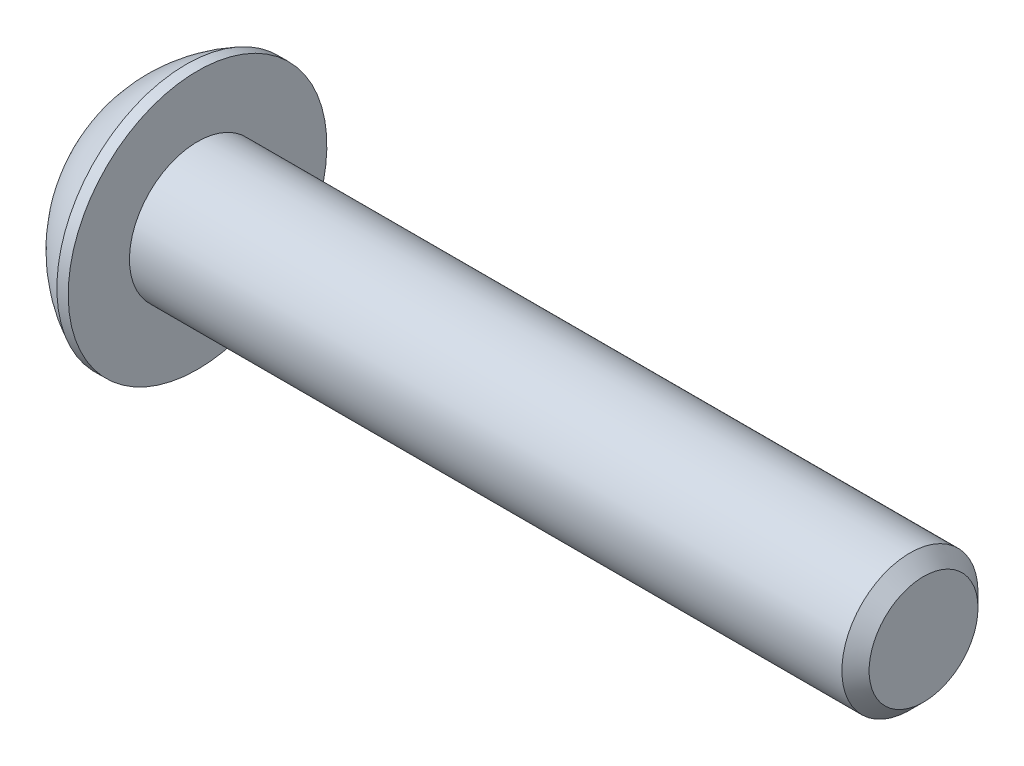
ISO-10303-21;
HEADER;
FILE_DESCRIPTION(('STEP AP214'),'2;1');
FILE_NAME('part.step','',(''),(''),'','','');
FILE_SCHEMA(('AUTOMOTIVE_DESIGN { 1 0 10303 214 1 1 1 1 }'));
ENDSEC;
DATA;
#1=APPLICATION_CONTEXT('core data for automotive mechanical design processes');
#2=APPLICATION_PROTOCOL_DEFINITION('international standard','automotive_design',2000,#1);
#3=PRODUCT_CONTEXT('',#1,'mechanical');
#4=PRODUCT('Part','Part','',(#3));
#5=PRODUCT_RELATED_PRODUCT_CATEGORY('part','',(#4));
#6=PRODUCT_DEFINITION_FORMATION('','',#4);
#7=PRODUCT_DEFINITION_CONTEXT('part definition',#1,'design');
#8=PRODUCT_DEFINITION('design','',#6,#7);
#9=PRODUCT_DEFINITION_SHAPE('','',#8);
#10=(LENGTH_UNIT() NAMED_UNIT(*) SI_UNIT(.MILLI.,.METRE.));
#11=(NAMED_UNIT(*) PLANE_ANGLE_UNIT() SI_UNIT($,.RADIAN.));
#12=(NAMED_UNIT(*) SI_UNIT($,.STERADIAN.) SOLID_ANGLE_UNIT());
#13=UNCERTAINTY_MEASURE_WITH_UNIT(LENGTH_MEASURE(1.E-05),#10,'distance_accuracy_value','');
#14=(GEOMETRIC_REPRESENTATION_CONTEXT(3) GLOBAL_UNCERTAINTY_ASSIGNED_CONTEXT((#13)) GLOBAL_UNIT_ASSIGNED_CONTEXT((#10,
#11,#12)) REPRESENTATION_CONTEXT('',''));
#15=CARTESIAN_POINT('',(0.,0.,0.));
#16=DIRECTION('',(0.,0.,1.));
#17=DIRECTION('',(1.,0.,0.));
#18=AXIS2_PLACEMENT_3D('',#15,#16,#17);
#19=CARTESIAN_POINT('',(-16.,0.,0.));
#20=DIRECTION('',(1.,0.,0.));
#21=DIRECTION('',(0.,0.,-1.));
#22=AXIS2_PLACEMENT_3D('',#19,#20,#21);
#23=CYLINDRICAL_SURFACE('',#22,1.5);
#24=CARTESIAN_POINT('',(-0.299999999999998,0.,0.));
#25=DIRECTION('',(1.,0.,0.));
#26=DIRECTION('',(0.,0.,-1.));
#27=AXIS2_PLACEMENT_3D('',#24,#25,#26);
#28=CIRCLE('',#27,1.5);
#29=CARTESIAN_POINT('',(-0.299999999999998,0.,-1.5));
#30=VERTEX_POINT('',#29);
#31=EDGE_CURVE('E55',#30,#30,#28,.F.);
#32=ORIENTED_EDGE('',*,*,#31,.T.);
#33=EDGE_LOOP('',(#32));
#34=FACE_BOUND('',#33,.T.);
#35=CARTESIAN_POINT('',(-16.,0.,0.));
#36=DIRECTION('',(-1.,0.,0.));
#37=DIRECTION('',(0.,-1.,0.));
#38=AXIS2_PLACEMENT_3D('',#35,#36,#37);
#39=CIRCLE('',#38,1.5);
#40=CARTESIAN_POINT('',(-16.,-1.50000000000001,0.));
#41=VERTEX_POINT('',#40);
#42=EDGE_CURVE('E134',#41,#41,#39,.F.);
#43=ORIENTED_EDGE('',*,*,#42,.T.);
#44=EDGE_LOOP('',(#43));
#45=FACE_BOUND('',#44,.T.);
#46=ADVANCED_FACE('F41',(#34,#45),#23,.T.);
#47=CARTESIAN_POINT('',(0.,0.,0.));
#48=DIRECTION('',(1.,0.,0.));
#49=DIRECTION('',(0.,0.,-1.));
#50=AXIS2_PLACEMENT_3D('',#47,#48,#49);
#51=PLANE('',#50);
#52=CARTESIAN_POINT('',(0.,0.,0.));
#53=DIRECTION('',(1.,0.,0.));
#54=DIRECTION('',(0.,0.,-1.));
#55=AXIS2_PLACEMENT_3D('',#52,#53,#54);
#56=CIRCLE('',#55,1.2);
#57=CARTESIAN_POINT('',(0.,0.,-1.2));
#58=VERTEX_POINT('',#57);
#59=EDGE_CURVE('E137',#58,#58,#56,.T.);
#60=ORIENTED_EDGE('',*,*,#59,.T.);
#61=EDGE_LOOP('',(#60));
#62=FACE_BOUND('',#61,.T.);
#63=ADVANCED_FACE('F147',(#62),#51,.T.);
#64=CARTESIAN_POINT('',(0.,0.,0.));
#65=DIRECTION('',(-1.,0.,0.));
#66=DIRECTION('',(0.,0.,1.));
#67=AXIS2_PLACEMENT_3D('',#64,#65,#66);
#68=CONICAL_SURFACE('',#67,1.2,0.785398163397444);
#69=ORIENTED_EDGE('',*,*,#31,.F.);
#70=EDGE_LOOP('',(#69));
#71=FACE_BOUND('',#70,.T.);
#72=ORIENTED_EDGE('',*,*,#59,.F.);
#73=EDGE_LOOP('',(#72));
#74=FACE_BOUND('',#73,.T.);
#75=ADVANCED_FACE('F43',(#71,#74),#68,.T.);
#76=CARTESIAN_POINT('',(-17.65,0.,0.));
#77=DIRECTION('',(1.,0.,0.));
#78=DIRECTION('',(0.,1.,0.));
#79=AXIS2_PLACEMENT_3D('',#76,#77,#78);
#80=PLANE('',#79);
#81=CARTESIAN_POINT('',(-17.65,0.,0.));
#82=DIRECTION('',(-1.,0.,0.));
#83=DIRECTION('',(0.,-1.,0.));
#84=AXIS2_PLACEMENT_3D('',#81,#82,#83);
#85=CIRCLE('',#84,1.20470053837926);
#86=CARTESIAN_POINT('',(-17.65,-1.20470053837926,0.));
#87=VERTEX_POINT('',#86);
#88=EDGE_CURVE('E256',#87,#87,#85,.T.);
#89=ORIENTED_EDGE('',*,*,#88,.F.);
#90=EDGE_LOOP('',(#89));
#91=FACE_BOUND('',#90,.T.);
#92=CARTESIAN_POINT('',(-17.65,0.,0.));
#93=DIRECTION('',(-1.,0.,0.));
#94=DIRECTION('',(0.,-1.,0.));
#95=AXIS2_PLACEMENT_3D('',#92,#93,#94);
#96=CIRCLE('',#95,1.5);
#97=CARTESIAN_POINT('',(-17.65,1.5,0.));
#98=VERTEX_POINT('',#97);
#99=EDGE_CURVE('E131',#98,#98,#96,.T.);
#100=ORIENTED_EDGE('',*,*,#99,.T.);
#101=EDGE_LOOP('',(#100));
#102=FACE_BOUND('',#101,.T.);
#103=ADVANCED_FACE('F146',(#91,#102),#80,.F.);
#104=CARTESIAN_POINT('',(-14.8526785714286,0.,0.));
#105=DIRECTION('',(-1.,0.,0.));
#106=DIRECTION('',(0.,1.,0.));
#107=AXIS2_PLACEMENT_3D('',#104,#105,#106);
#108=SPHERICAL_SURFACE('',#107,3.17411517981703);
#109=CARTESIAN_POINT('',(-16.25,0.,0.));
#110=DIRECTION('',(-1.,0.,0.));
#111=DIRECTION('',(0.,-1.,0.));
#112=AXIS2_PLACEMENT_3D('',#109,#110,#111);
#113=CIRCLE('',#112,2.85);
#114=CARTESIAN_POINT('',(-16.25,2.85,0.));
#115=VERTEX_POINT('',#114);
#116=EDGE_CURVE('E128',#115,#115,#113,.T.);
#117=CARTESIAN_POINT('',(-17.65,1.5,0.));
#118=CARTESIAN_POINT('',(-17.6402697017537,1.51814590550861,0.));
#119=CARTESIAN_POINT('',(-17.6303627914101,1.53619710575443,0.));
#120=CARTESIAN_POINT('',(-17.6101996026695,1.57210331824231,0.));
#121=CARTESIAN_POINT('',(-17.5999433242725,1.58995833048437,0.));
#122=CARTESIAN_POINT('',(-17.5790852555662,1.62546538948657,0.));
#123=CARTESIAN_POINT('',(-17.5684834652569,1.6431174362467,0.));
#124=CARTESIAN_POINT('',(-17.5469383951658,1.67821188357876,0.));
#125=CARTESIAN_POINT('',(-17.535995115384,1.69565428415068,0.));
#126=CARTESIAN_POINT('',(-17.513771208612,1.73032283245973,0.));
#127=CARTESIAN_POINT('',(-17.5024905816219,1.74754898019686,0.));
#128=CARTESIAN_POINT('',(-17.4795962529979,1.78177849951501,0.));
#129=CARTESIAN_POINT('',(-17.467982551364,1.79878187109604,0.));
#130=CARTESIAN_POINT('',(-17.4444264714719,1.83255939876409,0.));
#131=CARTESIAN_POINT('',(-17.4324840932136,1.84933355485112,0.));
#132=CARTESIAN_POINT('',(-17.4082751827463,1.88264629910088,0.));
#133=CARTESIAN_POINT('',(-17.3960086505372,1.89918488726362,0.));
#134=CARTESIAN_POINT('',(-17.3711560775515,1.93202023241769,0.));
#135=CARTESIAN_POINT('',(-17.3585700367748,1.94831698940902,0.));
#136=CARTESIAN_POINT('',(-17.3330832130497,1.98066250056315,0.));
#137=CARTESIAN_POINT('',(-17.3201824301012,1.99671125472595,0.));
#138=CARTESIAN_POINT('',(-17.2940710076189,2.02855468248373,0.));
#139=CARTESIAN_POINT('',(-17.2808603680851,2.04434935607872,0.));
#140=CARTESIAN_POINT('',(-17.254134235364,2.07567864118366,0.));
#141=CARTESIAN_POINT('',(-17.2406187421766,2.09121325269361,0.));
#142=CARTESIAN_POINT('',(-17.2132880205292,2.12201653059784,0.));
#143=CARTESIAN_POINT('',(-17.1994727920692,2.13728519699211,0.));
#144=CARTESIAN_POINT('',(-17.1715478317686,2.16755080234906,0.));
#145=CARTESIAN_POINT('',(-17.157438099928,2.18254774131173,0.));
#146=CARTESIAN_POINT('',(-17.1289294762883,2.21226421239399,0.));
#147=CARTESIAN_POINT('',(-17.1145305844891,2.22698374451357,0.));
#148=CARTESIAN_POINT('',(-17.0854490938605,2.25613982755346,0.));
#149=CARTESIAN_POINT('',(-17.0707664950309,2.27057637847377,0.));
#150=CARTESIAN_POINT('',(-17.0411231507109,2.29916103192521,0.));
#151=CARTESIAN_POINT('',(-17.0261624052204,2.31330913445635,0.));
#152=CARTESIAN_POINT('',(-16.9959684332833,2.34131153317633,0.));
#153=CARTESIAN_POINT('',(-16.9807352068367,2.35516582936518,0.));
#154=CARTESIAN_POINT('',(-16.9500020418819,2.38257536871331,0.));
#155=CARTESIAN_POINT('',(-16.9345021033738,2.3961306118726,0.));
#156=CARTESIAN_POINT('',(-16.9032413841958,2.42293691172713,0.));
#157=CARTESIAN_POINT('',(-16.887480603526,2.43618796842238,0.));
#158=CARTESIAN_POINT('',(-16.8557041687066,2.46238087711119,0.));
#159=CARTESIAN_POINT('',(-16.839688514557,2.47532272910475,0.));
#160=CARTESIAN_POINT('',(-16.8074083979817,2.50089232724988,0.));
#161=CARTESIAN_POINT('',(-16.7911439355561,2.51352007340145,0.));
#162=CARTESIAN_POINT('',(-16.7583723618573,2.53845667767541,0.));
#163=CARTESIAN_POINT('',(-16.7418652505841,2.55076553579779,0.));
#164=CARTESIAN_POINT('',(-16.7086146305115,2.57505970259154,0.));
#165=CARTESIAN_POINT('',(-16.691871121712,2.58704501126291,0.));
#166=CARTESIAN_POINT('',(-16.658154047431,2.61068754025891,0.));
#167=CARTESIAN_POINT('',(-16.6411804819494,2.62234476058354,0.));
#168=CARTESIAN_POINT('',(-16.607009722279,2.64532669825232,0.));
#169=CARTESIAN_POINT('',(-16.5898125280901,2.65665141559648,0.));
#170=CARTESIAN_POINT('',(-16.5552010236432,2.6789640585411,0.));
#171=CARTESIAN_POINT('',(-16.5377867133852,2.68995198414156,0.));
#172=CARTESIAN_POINT('',(-16.5027475717571,2.71158688256655,0.));
#173=CARTESIAN_POINT('',(-16.485122740387,2.72223385539107,0.));
#174=CARTESIAN_POINT('',(-16.449669230859,2.74318281565686,0.));
#175=CARTESIAN_POINT('',(-16.4318405527012,2.75348480309813,0.));
#176=CARTESIAN_POINT('',(-16.395986102456,2.7737398932333,0.));
#177=CARTESIAN_POINT('',(-16.3779603303685,2.78369299592719,0.));
#178=CARTESIAN_POINT('',(-16.3417185147769,2.8032465396409,0.));
#179=CARTESIAN_POINT('',(-16.3235024712727,2.81284698066071,0.));
#180=CARTESIAN_POINT('',(-16.2868870260232,2.83169159380608,0.));
#181=CARTESIAN_POINT('',(-16.268487624278,2.84093576593164,0.));
#182=CARTESIAN_POINT('',(-16.25,2.85,0.));
#183=B_SPLINE_CURVE_WITH_KNOTS('',3,(#117,#118,#119,#120,#121,#122,#123,#124,#125,#126,#127,
#128,#129,#130,#131,#132,#133,#134,#135,#136,#137,#138,#139,#140,#141,#142,#143,#144,#145,#146,
#147,#148,#149,#150,#151,#152,#153,#154,#155,#156,#157,#158,#159,#160,#161,#162,#163,#164,#165,
#166,#167,#168,#169,#170,#171,#172,#173,#174,#175,#176,#177,#178,#179,#180,#181,#182),
.UNSPECIFIED.,.F.,.F.,(4,2,2,2,2,2,2,2,2,2,2,2,2,2,2,2,2,2,2,2,2,2,2,2,2,2,2,2,2,2,2,2,4),(0.,
0.0617693508858087,0.123538701771618,0.185308052657427,0.247077403543236,0.308846754429046,
0.370616105314855,0.432385456200665,0.494154807086473,0.555924157972284,0.617693508858093,
0.679462859743903,0.741232210629712,0.80300156151552,0.864770912401332,0.926540263287141,
0.988309614172948,1.05007896505876,1.11184831594457,1.17361766683038,1.23538701771619,
1.297156368602,1.35892571948781,1.42069507037361,1.48246442125942,1.54423377214523,
1.60600312303104,1.66777247391685,1.72954182480266,1.79131117568847,1.85308052657428,
1.91484987746009,1.9766192283459),.UNSPECIFIED.);
#184=EDGE_CURVE('BSEAM158',#98,#115,#183,.T.);
#185=ORIENTED_EDGE('',*,*,#99,.F.);
#186=ORIENTED_EDGE('',*,*,#116,.T.);
#187=ORIENTED_EDGE('',*,*,#184,.T.);
#188=ORIENTED_EDGE('',*,*,#184,.F.);
#189=EDGE_LOOP('',(#185,#187,#186,#188));
#190=FACE_BOUND('',#189,.T.);
#191=ADVANCED_FACE('F158',(#190),#108,.T.);
#192=CARTESIAN_POINT('',(-16.,0.,0.));
#193=DIRECTION('',(-1.,0.,0.));
#194=DIRECTION('',(0.,-1.,0.));
#195=AXIS2_PLACEMENT_3D('',#192,#193,#194);
#196=CYLINDRICAL_SURFACE('',#195,2.85);
#197=ORIENTED_EDGE('',*,*,#116,.F.);
#198=EDGE_LOOP('',(#197));
#199=FACE_BOUND('',#198,.T.);
#200=CARTESIAN_POINT('',(-16.,0.,0.));
#201=DIRECTION('',(-1.,0.,0.));
#202=DIRECTION('',(0.,-1.,0.));
#203=AXIS2_PLACEMENT_3D('',#200,#201,#202);
#204=CIRCLE('',#203,2.85);
#205=CARTESIAN_POINT('',(-16.,-2.85,0.));
#206=VERTEX_POINT('',#205);
#207=EDGE_CURVE('E125',#206,#206,#204,.T.);
#208=ORIENTED_EDGE('',*,*,#207,.T.);
#209=EDGE_LOOP('',(#208));
#210=FACE_BOUND('',#209,.T.);
#211=ADVANCED_FACE('F162',(#199,#210),#196,.T.);
#212=CARTESIAN_POINT('',(-16.,2.85,0.));
#213=DIRECTION('',(-1.,0.,0.));
#214=DIRECTION('',(0.,-1.,0.));
#215=AXIS2_PLACEMENT_3D('',#212,#213,#214);
#216=PLANE('',#215);
#217=ORIENTED_EDGE('',*,*,#42,.F.);
#218=EDGE_LOOP('',(#217));
#219=FACE_BOUND('',#218,.T.);
#220=ORIENTED_EDGE('',*,*,#207,.F.);
#221=EDGE_LOOP('',(#220));
#222=FACE_BOUND('',#221,.T.);
#223=ADVANCED_FACE('F166',(#219,#222),#216,.F.);
#224=CARTESIAN_POINT('',(-17.65,0.,0.));
#225=DIRECTION('',(-1.,0.,0.));
#226=DIRECTION('',(0.,-1.,0.));
#227=AXIS2_PLACEMENT_3D('',#224,#225,#226);
#228=CONICAL_SURFACE('',#227,1.20470053837926,0.78539816339745);
#229=ORIENTED_EDGE('',*,*,#88,.T.);
#230=EDGE_LOOP('',(#229));
#231=FACE_BOUND('',#230,.T.);
#232=CARTESIAN_POINT('',(-18.0125645579163,-1.20678079288096,1.));
#233=CARTESIAN_POINT('',(-17.9901238799752,-1.17763239380938,1.));
#234=CARTESIAN_POINT('',(-17.9678867609271,-1.14832777655038,1.));
#235=CARTESIAN_POINT('',(-17.9239053230859,-1.0893407399734,1.));
#236=CARTESIAN_POINT('',(-17.902161120887,-1.05965823380996,1.));
#237=CARTESIAN_POINT('',(-17.8374858802222,-0.969511619364378,1.));
#238=CARTESIAN_POINT('',(-17.795456442765,-0.908390032886408,1.));
#239=CARTESIAN_POINT('',(-17.7124203349119,-0.779849899214033,1.));
#240=CARTESIAN_POINT('',(-17.6716484956871,-0.71227804773396,1.));
#241=CARTESIAN_POINT('',(-17.5967056855402,-0.573692441836176,1.));
#242=CARTESIAN_POINT('',(-17.5625124208036,-0.502691370033587,1.));
#243=CARTESIAN_POINT('',(-17.5206648240494,-0.396633108483665,1.));
#244=CARTESIAN_POINT('',(-17.508752424601,-0.363265114723093,1.));
#245=CARTESIAN_POINT('',(-17.4876010580815,-0.29567514486369,1.));
#246=CARTESIAN_POINT('',(-17.4783622608543,-0.261453114661029,1.));
#247=CARTESIAN_POINT('',(-17.4632108375931,-0.192964714439424,1.));
#248=CARTESIAN_POINT('',(-17.4572372079353,-0.158712062702428,1.));
#249=CARTESIAN_POINT('',(-17.4487381792859,-0.0897678989597863,1.));
#250=CARTESIAN_POINT('',(-17.4462131691607,-0.0550763379077878,1.));
#251=CARTESIAN_POINT('',(-17.4448308242394,0.0128534343372046,1.));
#252=CARTESIAN_POINT('',(-17.4458171333425,0.0460884918414699,1.));
#253=CARTESIAN_POINT('',(-17.4510428296463,0.112288777523358,1.));
#254=CARTESIAN_POINT('',(-17.4552814228284,0.14525406957693,1.));
#255=CARTESIAN_POINT('',(-17.4668431932388,0.211252641710477,1.));
#256=CARTESIAN_POINT('',(-17.4742213991969,0.24427612610642,1.));
#257=CARTESIAN_POINT('',(-17.4916537633013,0.30959341617891,1.));
#258=CARTESIAN_POINT('',(-17.5017077720937,0.341887262472141,1.));
#259=CARTESIAN_POINT('',(-17.5364692676108,0.44118855611672,1.));
#260=CARTESIAN_POINT('',(-17.5650343603337,0.506841480843492,1.));
#261=CARTESIAN_POINT('',(-17.6286033694253,0.635081389212378,1.));
#262=CARTESIAN_POINT('',(-17.663629955309,0.697656564069537,1.));
#263=CARTESIAN_POINT('',(-17.7359546107891,0.817274369694626,1.));
#264=CARTESIAN_POINT('',(-17.7730556162911,0.874437672313595,1.));
#265=CARTESIAN_POINT('',(-17.8304371678966,0.958655710303499,1.));
#266=CARTESIAN_POINT('',(-17.8497720189249,0.986366163766966,1.));
#267=CARTESIAN_POINT('',(-17.8889602713879,1.04140691974411,1.));
#268=CARTESIAN_POINT('',(-17.908813529201,1.06873732439883,1.));
#269=CARTESIAN_POINT('',(-17.92888195229,1.09590921458871,1.));
#270=B_SPLINE_CURVE_WITH_KNOTS('',3,(#232,#233,#234,#235,#236,#237,#238,#239,#240,#241,#242,
#243,#244,#245,#246,#247,#248,#249,#250,#251,#252,#253,#254,#255,#256,#257,#258,#259,#260,#261,
#262,#263,#264,#265,#266,#267,#268,#269),.UNSPECIFIED.,.F.,.F.,(4,2,2,2,2,2,2,2,2,2,2,2,2,2,2,2,
2,2,4),(0.,0.110355487284537,0.220736811203829,0.443178348562914,0.679759335181119,
0.915523888816468,1.02172703810025,1.1279369325962,1.23208803653003,1.33625088357217,
1.43583459192535,1.53539399546241,1.63677534642524,1.73815103982916,1.95232008261279,
2.16725532249798,2.37159620059984,2.47295962852457,2.57429526618465),.UNSPECIFIED.);
#271=CARTESIAN_POINT('',(-17.6,-0.577350269189625,1.));
#272=VERTEX_POINT('',#271);
#273=CARTESIAN_POINT('',(-17.6,0.577350269189628,1.));
#274=VERTEX_POINT('',#273);
#275=EDGE_CURVE('E109',#272,#274,#270,.T.);
#276=ORIENTED_EDGE('',*,*,#275,.F.);
#277=CARTESIAN_POINT('',(-17.6001154873726,-1.15481600843309,-0.00020000000000049));
#278=CARTESIAN_POINT('',(-17.5802779308257,-1.13496520795025,0.0341825950071804));
#279=CARTESIAN_POINT('',(-17.5616050206389,-1.11478247255942,0.0691401181398247));
#280=CARTESIAN_POINT('',(-17.5274147427231,-1.07362739529219,0.140422802956089));
#281=CARTESIAN_POINT('',(-17.5119164090234,-1.0526511355808,0.176754750528983));
#282=CARTESIAN_POINT('',(-17.4853673071423,-1.01035337909803,0.25001661380331));
#283=CARTESIAN_POINT('',(-17.4742497739969,-0.98904266610924,0.286927851445414));
#284=CARTESIAN_POINT('',(-17.4571198657762,-0.94595219928269,0.361562729310859));
#285=CARTESIAN_POINT('',(-17.4510946974667,-0.924173762626595,0.399284088108635));
#286=CARTESIAN_POINT('',(-17.4456605549675,-0.886641312640013,0.464292198417933));
#287=CARTESIAN_POINT('',(-17.4448569383167,-0.870936130672274,0.491494371528172));
#288=CARTESIAN_POINT('',(-17.4462066994169,-0.839556179862847,0.545846040669112));
#289=CARTESIAN_POINT('',(-17.4483607295472,-0.823881418494922,0.572995523754875));
#290=CARTESIAN_POINT('',(-17.4591169721285,-0.777080970599365,0.65405627732696));
#291=CARTESIAN_POINT('',(-17.4720145564153,-0.746188191116429,0.707564140978427));
#292=CARTESIAN_POINT('',(-17.5031407306022,-0.691968116419648,0.801476065143432));
#293=CARTESIAN_POINT('',(-17.5197377977018,-0.66838655729337,0.842320523671835));
#294=CARTESIAN_POINT('',(-17.5571249246853,-0.62214708593368,0.922409637381944));
#295=CARTESIAN_POINT('',(-17.5779013418174,-0.599486449584574,0.961659010870438));
#296=CARTESIAN_POINT('',(-17.6001154873726,-0.577234799135787,1.0002));
#297=B_SPLINE_CURVE_WITH_KNOTS('',3,(#277,#278,#279,#280,#281,#282,#283,#284,#285,#286,#287,
#288,#289,#290,#291,#292,#293,#294,#295,#296),.UNSPECIFIED.,.F.,.F.,(4,2,2,2,2,2,2,2,2,4),(0.,
0.13323767682856,0.26725222983449,0.3991370762693,0.530689603280768,0.624814864263846,
0.718960890149133,0.907306626112098,1.05710100361789,1.20641411519286),.UNSPECIFIED.);
#298=CARTESIAN_POINT('',(-17.6,-1.15470053837925,0.));
#299=VERTEX_POINT('',#298);
#300=EDGE_CURVE('E212',#299,#272,#297,.T.);
#301=ORIENTED_EDGE('',*,*,#300,.F.);
#302=CARTESIAN_POINT('',(-17.6001154873726,-0.577234799135786,-1.0002));
#303=CARTESIAN_POINT('',(-17.5802779308257,-0.59708559961862,-0.96581740499282));
#304=CARTESIAN_POINT('',(-17.5616050206389,-0.617268335009454,-0.930859881860176));
#305=CARTESIAN_POINT('',(-17.5274147427231,-0.658423412276684,-0.859577197043912));
#306=CARTESIAN_POINT('',(-17.5119164090234,-0.679399671988078,-0.823245249471017));
#307=CARTESIAN_POINT('',(-17.4853673071423,-0.721697428470845,-0.74998338619669));
#308=CARTESIAN_POINT('',(-17.4742497739969,-0.743008141459635,-0.713072148554586));
#309=CARTESIAN_POINT('',(-17.4571198657762,-0.786098608286185,-0.638437270689141));
#310=CARTESIAN_POINT('',(-17.4510946974667,-0.80787704494228,-0.600715911891364));
#311=CARTESIAN_POINT('',(-17.4456605549675,-0.845409494928862,-0.535707801582066));
#312=CARTESIAN_POINT('',(-17.4448569383167,-0.861114676896601,-0.508505628471828));
#313=CARTESIAN_POINT('',(-17.4462066994169,-0.892494627706028,-0.454153959330888));
#314=CARTESIAN_POINT('',(-17.4483607295472,-0.908169389073953,-0.427004476245124));
#315=CARTESIAN_POINT('',(-17.4591169721285,-0.95496983696951,-0.34594372267304));
#316=CARTESIAN_POINT('',(-17.4720145564153,-0.985862616452446,-0.292435859021573));
#317=CARTESIAN_POINT('',(-17.5031407306022,-1.04008269114923,-0.198523934856568));
#318=CARTESIAN_POINT('',(-17.5197377977018,-1.06366425027551,-0.157679476328165));
#319=CARTESIAN_POINT('',(-17.5571249246853,-1.1099037216352,-0.0775903626180562));
#320=CARTESIAN_POINT('',(-17.5779013418174,-1.1325643579843,-0.0383409891295622));
#321=CARTESIAN_POINT('',(-17.6001154873726,-1.15481600843309,0.000199999999999304));
#322=B_SPLINE_CURVE_WITH_KNOTS('',3,(#302,#303,#304,#305,#306,#307,#308,#309,#310,#311,#312,
#313,#314,#315,#316,#317,#318,#319,#320,#321),.UNSPECIFIED.,.F.,.F.,(4,2,2,2,2,2,2,2,2,4),(0.,
0.133237676828557,0.267252229834489,0.399137076269299,0.530689603280768,0.624814864263846,
0.718960890149133,0.907306626112098,1.05710100361789,1.20641411519286),.UNSPECIFIED.);
#323=CARTESIAN_POINT('',(-17.6,-0.577350269189625,-1.));
#324=VERTEX_POINT('',#323);
#325=EDGE_CURVE('E206',#324,#299,#322,.T.);
#326=ORIENTED_EDGE('',*,*,#325,.F.);
#327=CARTESIAN_POINT('',(-18.0125650614172,-1.20678144678531,-1.));
#328=CARTESIAN_POINT('',(-17.9901243639822,-1.17763302882144,-1.));
#329=CARTESIAN_POINT('',(-17.9678872254711,-1.14832839261352,-1.));
#330=CARTESIAN_POINT('',(-17.9239057488155,-1.08934131795804,-1.));
#331=CARTESIAN_POINT('',(-17.9021615272652,-1.05965879266498,-1.));
#332=CARTESIAN_POINT('',(-17.837486228163,-0.96951211969754,-1.));
#333=CARTESIAN_POINT('',(-17.7954567519025,-0.908390493450856,-1.));
#334=CARTESIAN_POINT('',(-17.7124205639502,-0.779850272991501,-1.));
#335=CARTESIAN_POINT('',(-17.67164868372,-0.71227837426064,-1.));
#336=CARTESIAN_POINT('',(-17.5967057974366,-0.573692669877684,-1.));
#337=CARTESIAN_POINT('',(-17.5625124975185,-0.502691546874,-1.));
#338=CARTESIAN_POINT('',(-17.5206648756311,-0.396633247077984,-1.));
#339=CARTESIAN_POINT('',(-17.5087524781389,-0.36326526987915,-1.));
#340=CARTESIAN_POINT('',(-17.4876011122146,-0.295675333788393,-1.));
#341=CARTESIAN_POINT('',(-17.4783623136284,-0.261453320791985,-1.));
#342=CARTESIAN_POINT('',(-17.4632108836686,-0.192964954456342,-1.));
#343=CARTESIAN_POINT('',(-17.4572372487852,-0.158712319385974,-1.));
#344=CARTESIAN_POINT('',(-17.4487382057865,-0.0897681885429893,-1.));
#345=CARTESIAN_POINT('',(-17.446213186537,-0.0550766437239885,-1.));
#346=CARTESIAN_POINT('',(-17.4448308203586,0.0128531008985441,-1.));
#347=CARTESIAN_POINT('',(-17.445817117779,0.0460881469709572,-1.));
#348=CARTESIAN_POINT('',(-17.4510427890576,0.112288411077529,-1.));
#349=CARTESIAN_POINT('',(-17.4552813688957,0.145253692987462,-1.));
#350=CARTESIAN_POINT('',(-17.4668431114854,0.211252245100414,-1.));
#351=CARTESIAN_POINT('',(-17.474221302878,0.244275719655903,-1.));
#352=CARTESIAN_POINT('',(-17.4916536376949,0.309592991103826,-1.));
#353=CARTESIAN_POINT('',(-17.5017076317658,0.34188682861279,-1.));
#354=CARTESIAN_POINT('',(-17.5364690589811,0.441188030105117,-1.));
#355=CARTESIAN_POINT('',(-17.5650340890574,0.50684087608607,-1.));
#356=CARTESIAN_POINT('',(-17.6286029659001,0.635080633024427,-1.));
#357=CARTESIAN_POINT('',(-17.663629482132,0.697655735234006,-1.));
#358=CARTESIAN_POINT('',(-17.7359540043354,0.817273410459784,-1.));
#359=CARTESIAN_POINT('',(-17.7730549468408,0.874436654853337,-1.));
#360=CARTESIAN_POINT('',(-17.8304364042781,0.958654606765364,-1.));
#361=CARTESIAN_POINT('',(-17.8497712241667,0.986365031952251,-1.));
#362=CARTESIAN_POINT('',(-17.8889594143893,1.041405731563,-1.));
#363=CARTESIAN_POINT('',(-17.9088126411017,1.06873610812795,-1.));
#364=CARTESIAN_POINT('',(-17.9288810331298,1.09590797027909,-1.));
#365=B_SPLINE_CURVE_WITH_KNOTS('',3,(#327,#328,#329,#330,#331,#332,#333,#334,#335,#336,#337,
#338,#339,#340,#341,#342,#343,#344,#345,#346,#347,#348,#349,#350,#351,#352,#353,#354,#355,#356,
#357,#358,#359,#360,#361,#362,#363,#364),.UNSPECIFIED.,.F.,.F.,(4,2,2,2,2,2,2,2,2,2,2,2,2,2,2,2,
2,2,4),(0.,0.110355567866854,0.220736972391892,0.443178673979242,0.679759845471901,
0.915524582194855,1.02172768288057,1.12793752886234,1.23208858652571,1.33625138728838,
1.43583506047458,1.53539442879914,1.63677574143709,1.73815139653142,1.95232014898536,
2.16725509662759,2.3715957252827,2.47295903017567,2.57429454481414),.UNSPECIFIED.);
#366=CARTESIAN_POINT('',(-17.6,0.577350269189628,-1.));
#367=VERTEX_POINT('',#366);
#368=EDGE_CURVE('E62',#367,#324,#365,.F.);
#369=ORIENTED_EDGE('',*,*,#368,.F.);
#370=CARTESIAN_POINT('',(-17.6001154873726,1.15481600843309,0.000200000000000285));
#371=CARTESIAN_POINT('',(-17.5802779308257,1.13496520795026,-0.0341825950071794));
#372=CARTESIAN_POINT('',(-17.5616050206389,1.11478247255942,-0.0691401181398234));
#373=CARTESIAN_POINT('',(-17.5274147427231,1.07362739529219,-0.140422802956088));
#374=CARTESIAN_POINT('',(-17.5119164090234,1.0526511355808,-0.176754750528983));
#375=CARTESIAN_POINT('',(-17.4853673071423,1.01035337909803,-0.250016613803311));
#376=CARTESIAN_POINT('',(-17.4742497739969,0.989042666109243,-0.286927851445414));
#377=CARTESIAN_POINT('',(-17.4571198657762,0.945952199282693,-0.361562729310859));
#378=CARTESIAN_POINT('',(-17.4510946974667,0.924173762626598,-0.399284088108636));
#379=CARTESIAN_POINT('',(-17.4456605549675,0.886641312640016,-0.464292198417934));
#380=CARTESIAN_POINT('',(-17.4448569383167,0.870936130672277,-0.491494371528173));
#381=CARTESIAN_POINT('',(-17.4462066994169,0.83955617986285,-0.545846040669113));
#382=CARTESIAN_POINT('',(-17.4483607295472,0.823881418494925,-0.572995523754876));
#383=CARTESIAN_POINT('',(-17.4591169721285,0.777080970599368,-0.654056277326961));
#384=CARTESIAN_POINT('',(-17.4720145564153,0.746188191116432,-0.707564140978428));
#385=CARTESIAN_POINT('',(-17.5031407306022,0.691968116419651,-0.801476065143432));
#386=CARTESIAN_POINT('',(-17.5197377977018,0.668386557293373,-0.842320523671835));
#387=CARTESIAN_POINT('',(-17.5571249246853,0.622147085933683,-0.922409637381944));
#388=CARTESIAN_POINT('',(-17.5779013418174,0.599486449584577,-0.961659010870438));
#389=CARTESIAN_POINT('',(-17.6001154873726,0.57723479913579,-1.0002));
#390=B_SPLINE_CURVE_WITH_KNOTS('',3,(#370,#371,#372,#373,#374,#375,#376,#377,#378,#379,#380,
#381,#382,#383,#384,#385,#386,#387,#388,#389),.UNSPECIFIED.,.F.,.F.,(4,2,2,2,2,2,2,2,2,4),(0.,
0.133237676828558,0.267252229834489,0.399137076269299,0.530689603280769,0.624814864263847,
0.718960890149134,0.907306626112098,1.05710100361789,1.20641411519286),.UNSPECIFIED.);
#391=CARTESIAN_POINT('',(-17.6,1.15470053837925,0.));
#392=VERTEX_POINT('',#391);
#393=EDGE_CURVE('E11',#392,#367,#390,.T.);
#394=ORIENTED_EDGE('',*,*,#393,.F.);
#395=CARTESIAN_POINT('',(-17.6001154873726,0.57723479913579,1.0002));
#396=CARTESIAN_POINT('',(-17.5802779308257,0.597085599618623,0.96581740499282));
#397=CARTESIAN_POINT('',(-17.5616050206389,0.617268335009457,0.930859881860177));
#398=CARTESIAN_POINT('',(-17.5274147427231,0.658423412276687,0.859577197043912));
#399=CARTESIAN_POINT('',(-17.5119164090234,0.679399671988081,0.823245249471017));
#400=CARTESIAN_POINT('',(-17.4853673071423,0.721697428470847,0.74998338619669));
#401=CARTESIAN_POINT('',(-17.4742497739969,0.743008141459637,0.713072148554587));
#402=CARTESIAN_POINT('',(-17.4571198657762,0.786098608286187,0.638437270689142));
#403=CARTESIAN_POINT('',(-17.4510946974667,0.807877044942282,0.600715911891366));
#404=CARTESIAN_POINT('',(-17.4456605549675,0.845409494928864,0.535707801582068));
#405=CARTESIAN_POINT('',(-17.4448569383167,0.861114676896603,0.508505628471829));
#406=CARTESIAN_POINT('',(-17.4462066994169,0.89249462770603,0.454153959330889));
#407=CARTESIAN_POINT('',(-17.4483607295472,0.908169389073955,0.427004476245126));
#408=CARTESIAN_POINT('',(-17.4591169721285,0.954969836969512,0.345943722673041));
#409=CARTESIAN_POINT('',(-17.4720145564153,0.985862616452448,0.292435859021574));
#410=CARTESIAN_POINT('',(-17.5031407306022,1.04008269114923,0.198523934856569));
#411=CARTESIAN_POINT('',(-17.5197377977018,1.06366425027551,0.157679476328166));
#412=CARTESIAN_POINT('',(-17.5571249246853,1.1099037216352,0.0775903626180563));
#413=CARTESIAN_POINT('',(-17.5779013418174,1.1325643579843,0.0383409891295623));
#414=CARTESIAN_POINT('',(-17.6001154873726,1.15481600843309,-0.000199999999999644));
#415=B_SPLINE_CURVE_WITH_KNOTS('',3,(#395,#396,#397,#398,#399,#400,#401,#402,#403,#404,#405,
#406,#407,#408,#409,#410,#411,#412,#413,#414),.UNSPECIFIED.,.F.,.F.,(4,2,2,2,2,2,2,2,2,4),(0.,
0.133237676828558,0.267252229834488,0.399137076269298,0.530689603280766,0.624814864263844,
0.718960890149131,0.907306626112095,1.05710100361789,1.20641411519286),.UNSPECIFIED.);
#416=EDGE_CURVE('E100',#274,#392,#415,.T.);
#417=ORIENTED_EDGE('',*,*,#416,.F.);
#418=EDGE_LOOP('',(#276,#301,#326,#369,#394,#417));
#419=FACE_BOUND('',#418,.T.);
#420=ADVANCED_FACE('F99',(#231,#419),#228,.F.);
#421=CARTESIAN_POINT('',(-16.45,0.,0.));
#422=DIRECTION('',(-1.,0.,0.));
#423=DIRECTION('',(0.,0.,1.));
#424=AXIS2_PLACEMENT_3D('',#421,#422,#423);
#425=PLANE('',#424);
#426=DIRECTION('',(0.,0.5,-0.866025403784439));
#427=VECTOR('',#426,1.);
#428=CARTESIAN_POINT('',(-16.45,0.577350269189627,1.));
#429=LINE('',#428,#427);
#430=CARTESIAN_POINT('',(-16.45,0.577350269189627,1.));
#431=VERTEX_POINT('',#430);
#432=CARTESIAN_POINT('',(-16.45,1.15470053837925,0.));
#433=VERTEX_POINT('',#432);
#434=EDGE_CURVE('E108',#431,#433,#429,.T.);
#435=ORIENTED_EDGE('',*,*,#434,.T.);
#436=DIRECTION('',(0.,-0.5,-0.866025403784439));
#437=VECTOR('',#436,1.);
#438=CARTESIAN_POINT('',(-16.45,1.15470053837925,0.));
#439=LINE('',#438,#437);
#440=CARTESIAN_POINT('',(-16.45,0.577350269189628,-1.));
#441=VERTEX_POINT('',#440);
#442=EDGE_CURVE('E113',#433,#441,#439,.T.);
#443=ORIENTED_EDGE('',*,*,#442,.T.);
#444=DIRECTION('',(0.,-1.,0.));
#445=VECTOR('',#444,1.);
#446=CARTESIAN_POINT('',(-16.45,0.577350269189628,-1.));
#447=LINE('',#446,#445);
#448=CARTESIAN_POINT('',(-16.45,-0.577350269189624,-1.));
#449=VERTEX_POINT('',#448);
#450=EDGE_CURVE('E238',#441,#449,#447,.T.);
#451=ORIENTED_EDGE('',*,*,#450,.T.);
#452=DIRECTION('',(0.,-0.5,0.866025403784439));
#453=VECTOR('',#452,1.);
#454=CARTESIAN_POINT('',(-16.45,-0.577350269189624,-1.));
#455=LINE('',#454,#453);
#456=CARTESIAN_POINT('',(-16.45,-1.15470053837925,0.));
#457=VERTEX_POINT('',#456);
#458=EDGE_CURVE('E242',#449,#457,#455,.T.);
#459=ORIENTED_EDGE('',*,*,#458,.T.);
#460=DIRECTION('',(0.,0.5,0.866025403784439));
#461=VECTOR('',#460,1.);
#462=CARTESIAN_POINT('',(-16.45,-1.15470053837925,0.));
#463=LINE('',#462,#461);
#464=CARTESIAN_POINT('',(-16.45,-0.577350269189625,1.));
#465=VERTEX_POINT('',#464);
#466=EDGE_CURVE('E121',#457,#465,#463,.T.);
#467=ORIENTED_EDGE('',*,*,#466,.T.);
#468=DIRECTION('',(0.,1.,0.));
#469=VECTOR('',#468,1.);
#470=CARTESIAN_POINT('',(-16.45,-0.577350269189625,1.));
#471=LINE('',#470,#469);
#472=EDGE_CURVE('E116',#465,#431,#471,.T.);
#473=ORIENTED_EDGE('',*,*,#472,.T.);
#474=EDGE_LOOP('',(#435,#443,#451,#459,#467,#473));
#475=FACE_BOUND('',#474,.T.);
#476=ADVANCED_FACE('F192',(#475),#425,.T.);
#477=CARTESIAN_POINT('',(-16.45,1.15470053837925,0.));
#478=DIRECTION('',(0.,0.866025403784439,-0.5));
#479=DIRECTION('',(0.,0.5,0.866025403784439));
#480=AXIS2_PLACEMENT_3D('',#477,#478,#479);
#481=PLANE('',#480);
#482=DIRECTION('',(-1.,0.,0.));
#483=VECTOR('',#482,1.);
#484=CARTESIAN_POINT('',(-16.45,1.15470053837925,0.));
#485=LINE('',#484,#483);
#486=EDGE_CURVE('E106',#433,#392,#485,.T.);
#487=ORIENTED_EDGE('',*,*,#486,.T.);
#488=ORIENTED_EDGE('',*,*,#393,.T.);
#489=DIRECTION('',(-1.,0.,0.));
#490=VECTOR('',#489,1.);
#491=CARTESIAN_POINT('',(-16.45,0.577350269189628,-1.));
#492=LINE('',#491,#490);
#493=EDGE_CURVE('E115',#441,#367,#492,.T.);
#494=ORIENTED_EDGE('',*,*,#493,.F.);
#495=ORIENTED_EDGE('',*,*,#442,.F.);
#496=EDGE_LOOP('',(#487,#488,#494,#495));
#497=FACE_BOUND('',#496,.T.);
#498=ADVANCED_FACE('F111',(#497),#481,.F.);
#499=CARTESIAN_POINT('',(-16.45,0.577350269189628,-1.));
#500=DIRECTION('',(0.,0.,-1.));
#501=DIRECTION('',(0.,1.,0.));
#502=AXIS2_PLACEMENT_3D('',#499,#500,#501);
#503=PLANE('',#502);
#504=ORIENTED_EDGE('',*,*,#493,.T.);
#505=ORIENTED_EDGE('',*,*,#368,.T.);
#506=DIRECTION('',(-1.,0.,0.));
#507=VECTOR('',#506,1.);
#508=CARTESIAN_POINT('',(-16.45,-0.577350269189624,-1.));
#509=LINE('',#508,#507);
#510=EDGE_CURVE('E118',#449,#324,#509,.T.);
#511=ORIENTED_EDGE('',*,*,#510,.F.);
#512=ORIENTED_EDGE('',*,*,#450,.F.);
#513=EDGE_LOOP('',(#504,#505,#511,#512));
#514=FACE_BOUND('',#513,.T.);
#515=ADVANCED_FACE('F227',(#514),#503,.F.);
#516=CARTESIAN_POINT('',(-16.45,-0.577350269189624,-1.));
#517=DIRECTION('',(0.,-0.866025403784438,-0.5));
#518=DIRECTION('',(0.,0.5,-0.866025403784439));
#519=AXIS2_PLACEMENT_3D('',#516,#517,#518);
#520=PLANE('',#519);
#521=ORIENTED_EDGE('',*,*,#510,.T.);
#522=ORIENTED_EDGE('',*,*,#325,.T.);
#523=DIRECTION('',(-1.,0.,0.));
#524=VECTOR('',#523,1.);
#525=CARTESIAN_POINT('',(-16.45,-1.15470053837925,0.));
#526=LINE('',#525,#524);
#527=EDGE_CURVE('E252',#457,#299,#526,.T.);
#528=ORIENTED_EDGE('',*,*,#527,.F.);
#529=ORIENTED_EDGE('',*,*,#458,.F.);
#530=EDGE_LOOP('',(#521,#522,#528,#529));
#531=FACE_BOUND('',#530,.T.);
#532=ADVANCED_FACE('F222',(#531),#520,.F.);
#533=CARTESIAN_POINT('',(-16.45,-1.15470053837925,0.));
#534=DIRECTION('',(0.,-0.866025403784439,0.5));
#535=DIRECTION('',(0.,-0.5,-0.866025403784439));
#536=AXIS2_PLACEMENT_3D('',#533,#534,#535);
#537=PLANE('',#536);
#538=ORIENTED_EDGE('',*,*,#527,.T.);
#539=ORIENTED_EDGE('',*,*,#300,.T.);
#540=DIRECTION('',(-1.,0.,0.));
#541=VECTOR('',#540,1.);
#542=CARTESIAN_POINT('',(-16.45,-0.577350269189625,1.));
#543=LINE('',#542,#541);
#544=EDGE_CURVE('E249',#465,#272,#543,.T.);
#545=ORIENTED_EDGE('',*,*,#544,.F.);
#546=ORIENTED_EDGE('',*,*,#466,.F.);
#547=EDGE_LOOP('',(#538,#539,#545,#546));
#548=FACE_BOUND('',#547,.T.);
#549=ADVANCED_FACE('F219',(#548),#537,.F.);
#550=CARTESIAN_POINT('',(-16.45,-0.577350269189625,1.));
#551=DIRECTION('',(0.,0.,1.));
#552=DIRECTION('',(1.,0.,0.));
#553=AXIS2_PLACEMENT_3D('',#550,#551,#552);
#554=PLANE('',#553);
#555=ORIENTED_EDGE('',*,*,#544,.T.);
#556=ORIENTED_EDGE('',*,*,#275,.T.);
#557=DIRECTION('',(-1.,0.,0.));
#558=VECTOR('',#557,1.);
#559=CARTESIAN_POINT('',(-16.45,0.577350269189627,1.));
#560=LINE('',#559,#558);
#561=EDGE_CURVE('E69',#431,#274,#560,.T.);
#562=ORIENTED_EDGE('',*,*,#561,.F.);
#563=ORIENTED_EDGE('',*,*,#472,.F.);
#564=EDGE_LOOP('',(#555,#556,#562,#563));
#565=FACE_BOUND('',#564,.T.);
#566=ADVANCED_FACE('F173',(#565),#554,.F.);
#567=CARTESIAN_POINT('',(-16.45,0.577350269189627,1.));
#568=DIRECTION('',(0.,0.866025403784439,0.5));
#569=DIRECTION('',(0.,-0.5,0.866025403784439));
#570=AXIS2_PLACEMENT_3D('',#567,#568,#569);
#571=PLANE('',#570);
#572=ORIENTED_EDGE('',*,*,#561,.T.);
#573=ORIENTED_EDGE('',*,*,#416,.T.);
#574=ORIENTED_EDGE('',*,*,#486,.F.);
#575=ORIENTED_EDGE('',*,*,#434,.F.);
#576=EDGE_LOOP('',(#572,#573,#574,#575));
#577=FACE_BOUND('',#576,.T.);
#578=ADVANCED_FACE('F105',(#577),#571,.F.);
#579=CLOSED_SHELL('',(#46,#63,#75,#103,#191,#211,#223,#420,#476,#498,#515,#532,#549,#566,#578));
#580=MANIFOLD_SOLID_BREP('B2',#579);
#581=ADVANCED_BREP_SHAPE_REPRESENTATION('',(#18,#580),#14);
#582=SHAPE_DEFINITION_REPRESENTATION(#9,#581);
ENDSEC;
END-ISO-10303-21;
